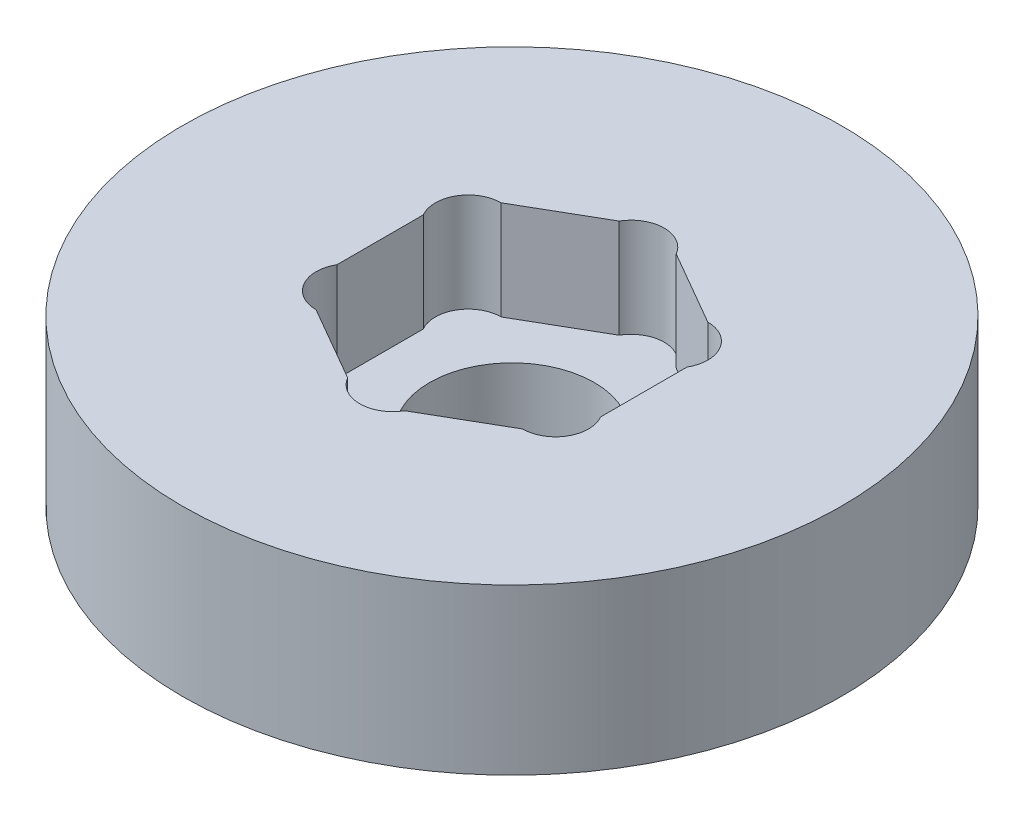
ISO-10303-21;
HEADER;
FILE_DESCRIPTION(('STEP AP214'),'2;1');
FILE_NAME('part.step','',(''),(''),'','','');
FILE_SCHEMA(('AUTOMOTIVE_DESIGN { 1 0 10303 214 1 1 1 1 }'));
ENDSEC;
DATA;
#1=APPLICATION_CONTEXT('core data for automotive mechanical design processes');
#2=APPLICATION_PROTOCOL_DEFINITION('international standard','automotive_design',2000,#1);
#3=PRODUCT_CONTEXT('',#1,'mechanical');
#4=PRODUCT('Part','Part','',(#3));
#5=PRODUCT_RELATED_PRODUCT_CATEGORY('part','',(#4));
#6=PRODUCT_DEFINITION_FORMATION('','',#4);
#7=PRODUCT_DEFINITION_CONTEXT('part definition',#1,'design');
#8=PRODUCT_DEFINITION('design','',#6,#7);
#9=PRODUCT_DEFINITION_SHAPE('','',#8);
#10=(LENGTH_UNIT() NAMED_UNIT(*) SI_UNIT(.MILLI.,.METRE.));
#11=(NAMED_UNIT(*) PLANE_ANGLE_UNIT() SI_UNIT($,.RADIAN.));
#12=(NAMED_UNIT(*) SI_UNIT($,.STERADIAN.) SOLID_ANGLE_UNIT());
#13=UNCERTAINTY_MEASURE_WITH_UNIT(LENGTH_MEASURE(1.E-05),#10,'distance_accuracy_value','');
#14=(GEOMETRIC_REPRESENTATION_CONTEXT(3) GLOBAL_UNCERTAINTY_ASSIGNED_CONTEXT((#13)) GLOBAL_UNIT_ASSIGNED_CONTEXT((#10,
#11,#12)) REPRESENTATION_CONTEXT('',''));
#15=CARTESIAN_POINT('',(0.,0.,0.));
#16=DIRECTION('',(0.,0.,1.));
#17=DIRECTION('',(1.,0.,0.));
#18=AXIS2_PLACEMENT_3D('',#15,#16,#17);
#19=CARTESIAN_POINT('',(0.,5.,0.));
#20=DIRECTION('',(0.,-1.,0.));
#21=DIRECTION('',(0.,0.,-1.));
#22=AXIS2_PLACEMENT_3D('',#19,#20,#21);
#23=CYLINDRICAL_SURFACE('',#22,10.);
#24=CARTESIAN_POINT('',(0.,5.,0.));
#25=DIRECTION('',(0.,1.,0.));
#26=DIRECTION('',(0.,0.,1.));
#27=AXIS2_PLACEMENT_3D('',#24,#25,#26);
#28=CIRCLE('',#27,10.);
#29=CARTESIAN_POINT('',(0.,5.,9.99999999999999));
#30=VERTEX_POINT('',#29);
#31=EDGE_CURVE('E11',#30,#30,#28,.T.);
#32=ORIENTED_EDGE('',*,*,#31,.F.);
#33=EDGE_LOOP('',(#32));
#34=FACE_BOUND('',#33,.T.);
#35=CARTESIAN_POINT('',(0.,0.,0.));
#36=DIRECTION('',(0.,1.,0.));
#37=DIRECTION('',(0.,0.,1.));
#38=AXIS2_PLACEMENT_3D('',#35,#36,#37);
#39=CIRCLE('',#38,10.);
#40=CARTESIAN_POINT('',(0.,0.,9.99999999999999));
#41=VERTEX_POINT('',#40);
#42=EDGE_CURVE('E43',#41,#41,#39,.T.);
#43=ORIENTED_EDGE('',*,*,#42,.T.);
#44=EDGE_LOOP('',(#43));
#45=FACE_BOUND('',#44,.T.);
#46=ADVANCED_FACE('F35',(#34,#45),#23,.T.);
#47=CARTESIAN_POINT('',(0.,5.,0.));
#48=DIRECTION('',(0.,1.,0.));
#49=DIRECTION('',(0.,0.,1.));
#50=AXIS2_PLACEMENT_3D('',#47,#48,#49);
#51=PLANE('',#50);
#52=CARTESIAN_POINT('',(-3.13397459621546,5.,-1.80940107675832));
#53=DIRECTION('',(0.,1.,0.));
#54=DIRECTION('',(0.,0.,1.));
#55=AXIS2_PLACEMENT_3D('',#52,#53,#54);
#56=CIRCLE('',#55,1.00000000000019);
#57=CARTESIAN_POINT('',(-3.13397459621554,5.,-2.80940107675852));
#58=VERTEX_POINT('',#57);
#59=CARTESIAN_POINT('',(-4.,5.,-1.30940107675811));
#60=VERTEX_POINT('',#59);
#61=EDGE_CURVE('E135',#58,#60,#56,.T.);
#62=ORIENTED_EDGE('',*,*,#61,.F.);
#63=DIRECTION('',(-0.866025403784439,0.,0.5));
#64=VECTOR('',#63,1.);
#65=CARTESIAN_POINT('',(0.,5.,-4.61880215351701));
#66=LINE('',#65,#64);
#67=CARTESIAN_POINT('',(-0.866025403784439,5.,-4.11880215351701));
#68=VERTEX_POINT('',#67);
#69=EDGE_CURVE('E142',#68,#58,#66,.T.);
#70=ORIENTED_EDGE('',*,*,#69,.F.);
#71=CARTESIAN_POINT('',(0.,5.,-3.61880215351701));
#72=DIRECTION('',(0.,1.,0.));
#73=DIRECTION('',(0.,0.,1.));
#74=AXIS2_PLACEMENT_3D('',#71,#72,#73);
#75=CIRCLE('',#74,1.);
#76=CARTESIAN_POINT('',(0.866025403784439,5.,-4.11880215351701));
#77=VERTEX_POINT('',#76);
#78=EDGE_CURVE('E58',#77,#68,#75,.T.);
#79=ORIENTED_EDGE('',*,*,#78,.F.);
#80=DIRECTION('',(-0.866025403784439,0.,-0.5));
#81=VECTOR('',#80,1.);
#82=CARTESIAN_POINT('',(4.,5.,-2.3094010767585));
#83=LINE('',#82,#81);
#84=CARTESIAN_POINT('',(3.13397459621516,5.,-2.80940107675874));
#85=VERTEX_POINT('',#84);
#86=EDGE_CURVE('E159',#85,#77,#83,.T.);
#87=ORIENTED_EDGE('',*,*,#86,.F.);
#88=CARTESIAN_POINT('',(3.13397459621566,5.,-1.80940107675868));
#89=DIRECTION('',(0.,1.,0.));
#90=DIRECTION('',(0.,0.,1.));
#91=AXIS2_PLACEMENT_3D('',#88,#89,#90);
#92=CIRCLE('',#91,1.00000000000006);
#93=CARTESIAN_POINT('',(4.,5.,-1.30940107675839));
#94=VERTEX_POINT('',#93);
#95=EDGE_CURVE('E378',#94,#85,#92,.T.);
#96=ORIENTED_EDGE('',*,*,#95,.F.);
#97=DIRECTION('',(0.,0.,-1.));
#98=VECTOR('',#97,1.);
#99=CARTESIAN_POINT('',(4.,5.,2.30940107675851));
#100=LINE('',#99,#98);
#101=CARTESIAN_POINT('',(4.,5.,1.30940107675727));
#102=VERTEX_POINT('',#101);
#103=EDGE_CURVE('E150',#102,#94,#100,.T.);
#104=ORIENTED_EDGE('',*,*,#103,.F.);
#105=CARTESIAN_POINT('',(3.13397459621587,5.,1.80940107675833));
#106=DIRECTION('',(0.,1.,0.));
#107=DIRECTION('',(0.,0.,1.));
#108=AXIS2_PLACEMENT_3D('',#105,#106,#107);
#109=CIRCLE('',#108,1.00000000000026);
#110=CARTESIAN_POINT('',(3.13397459621542,5.,2.80940107675858));
#111=VERTEX_POINT('',#110);
#112=EDGE_CURVE('E367',#111,#102,#109,.T.);
#113=ORIENTED_EDGE('',*,*,#112,.F.);
#114=DIRECTION('',(0.866025403784439,0.,-0.5));
#115=VECTOR('',#114,1.);
#116=CARTESIAN_POINT('',(0.,5.,4.61880215351701));
#117=LINE('',#116,#115);
#118=CARTESIAN_POINT('',(0.866025403785777,5.,4.11880215351623));
#119=VERTEX_POINT('',#118);
#120=EDGE_CURVE('E167',#119,#111,#117,.T.);
#121=ORIENTED_EDGE('',*,*,#120,.F.);
#122=CARTESIAN_POINT('',(4.10523822278712E-13,5.,3.61880215351701));
#123=DIRECTION('',(0.,1.,0.));
#124=DIRECTION('',(0.,0.,1.));
#125=AXIS2_PLACEMENT_3D('',#122,#123,#124);
#126=CIRCLE('',#125,1.00000000000042);
#127=CARTESIAN_POINT('',(-0.866025403784546,5.,4.11880215351695));
#128=VERTEX_POINT('',#127);
#129=EDGE_CURVE('E356',#128,#119,#126,.T.);
#130=ORIENTED_EDGE('',*,*,#129,.F.);
#131=DIRECTION('',(0.866025403784439,0.,0.5));
#132=VECTOR('',#131,1.);
#133=CARTESIAN_POINT('',(-4.,5.,2.3094010767585));
#134=LINE('',#133,#132);
#135=CARTESIAN_POINT('',(-3.13397459621459,5.,2.80940107675906));
#136=VERTEX_POINT('',#135);
#137=EDGE_CURVE('E165',#136,#128,#134,.T.);
#138=ORIENTED_EDGE('',*,*,#137,.F.);
#139=CARTESIAN_POINT('',(-3.13397459621525,5.,1.80940107675868));
#140=DIRECTION('',(0.,1.,0.));
#141=DIRECTION('',(0.,0.,1.));
#142=AXIS2_PLACEMENT_3D('',#139,#140,#141);
#143=CIRCLE('',#142,1.00000000000038);
#144=CARTESIAN_POINT('',(-4.,5.,1.30940107675846));
#145=VERTEX_POINT('',#144);
#146=EDGE_CURVE('E345',#145,#136,#143,.T.);
#147=ORIENTED_EDGE('',*,*,#146,.F.);
#148=DIRECTION('',(0.,0.,1.));
#149=VECTOR('',#148,1.);
#150=CARTESIAN_POINT('',(-4.,5.,-2.3094010767585));
#151=LINE('',#150,#149);
#152=EDGE_CURVE('E163',#60,#145,#151,.T.);
#153=ORIENTED_EDGE('',*,*,#152,.F.);
#154=EDGE_LOOP('',(#62,#70,#79,#87,#96,#104,#113,#121,#130,#138,#147,#153));
#155=FACE_BOUND('',#154,.T.);
#156=ORIENTED_EDGE('',*,*,#31,.T.);
#157=EDGE_LOOP('',(#156));
#158=FACE_BOUND('',#157,.T.);
#159=ADVANCED_FACE('F176',(#155,#158),#51,.T.);
#160=CARTESIAN_POINT('',(0.,0.,0.));
#161=DIRECTION('',(0.,1.,0.));
#162=DIRECTION('',(0.,0.,1.));
#163=AXIS2_PLACEMENT_3D('',#160,#161,#162);
#164=PLANE('',#163);
#165=CARTESIAN_POINT('',(0.,0.,0.));
#166=DIRECTION('',(0.,-1.,0.));
#167=DIRECTION('',(0.,0.,-1.));
#168=AXIS2_PLACEMENT_3D('',#165,#166,#167);
#169=CIRCLE('',#168,2.5);
#170=CARTESIAN_POINT('',(0.,0.,-2.5));
#171=VERTEX_POINT('',#170);
#172=EDGE_CURVE('E340',#171,#171,#169,.T.);
#173=ORIENTED_EDGE('',*,*,#172,.F.);
#174=EDGE_LOOP('',(#173));
#175=FACE_BOUND('',#174,.T.);
#176=ORIENTED_EDGE('',*,*,#42,.F.);
#177=EDGE_LOOP('',(#176));
#178=FACE_BOUND('',#177,.T.);
#179=ADVANCED_FACE('F173',(#175,#178),#164,.F.);
#180=CARTESIAN_POINT('',(4.,2.,-2.3094010767585));
#181=DIRECTION('',(0.5,0.,-0.866025403784439));
#182=DIRECTION('',(-0.866025403784439,0.,-0.5));
#183=AXIS2_PLACEMENT_3D('',#180,#181,#182);
#184=PLANE('',#183);
#185=DIRECTION('',(-0.866025403784439,0.,-0.5));
#186=VECTOR('',#185,1.);
#187=CARTESIAN_POINT('',(4.,2.,-2.3094010767585));
#188=LINE('',#187,#186);
#189=CARTESIAN_POINT('',(3.13397459621516,2.,-2.80940107675874));
#190=VERTEX_POINT('',#189);
#191=CARTESIAN_POINT('',(0.866025403784439,2.,-4.11880215351701));
#192=VERTEX_POINT('',#191);
#193=EDGE_CURVE('E146',#190,#192,#188,.T.);
#194=ORIENTED_EDGE('',*,*,#193,.F.);
#195=DIRECTION('',(0.,1.,0.));
#196=VECTOR('',#195,1.);
#197=CARTESIAN_POINT('',(3.13397459621516,2.,-2.80940107675874));
#198=LINE('',#197,#196);
#199=EDGE_CURVE('E386',#190,#85,#198,.T.);
#200=ORIENTED_EDGE('',*,*,#199,.T.);
#201=ORIENTED_EDGE('',*,*,#86,.T.);
#202=DIRECTION('',(0.,1.,0.));
#203=VECTOR('',#202,1.);
#204=CARTESIAN_POINT('',(0.866025403784439,2.,-4.11880215351701));
#205=LINE('',#204,#203);
#206=EDGE_CURVE('E161',#77,#192,#205,.F.);
#207=ORIENTED_EDGE('',*,*,#206,.T.);
#208=EDGE_LOOP('',(#194,#200,#201,#207));
#209=FACE_BOUND('',#208,.T.);
#210=ADVANCED_FACE('F175',(#209),#184,.F.);
#211=CARTESIAN_POINT('',(4.,2.,2.30940107675851));
#212=DIRECTION('',(1.,0.,0.));
#213=DIRECTION('',(0.,0.,-1.));
#214=AXIS2_PLACEMENT_3D('',#211,#212,#213);
#215=PLANE('',#214);
#216=DIRECTION('',(0.,0.,-1.));
#217=VECTOR('',#216,1.);
#218=CARTESIAN_POINT('',(4.,2.,2.30940107675851));
#219=LINE('',#218,#217);
#220=CARTESIAN_POINT('',(4.,2.,1.30940107675727));
#221=VERTEX_POINT('',#220);
#222=CARTESIAN_POINT('',(4.,2.,-1.30940107675839));
#223=VERTEX_POINT('',#222);
#224=EDGE_CURVE('E157',#221,#223,#219,.T.);
#225=ORIENTED_EDGE('',*,*,#224,.F.);
#226=DIRECTION('',(0.,1.,0.));
#227=VECTOR('',#226,1.);
#228=CARTESIAN_POINT('',(4.,2.,1.30940107675727));
#229=LINE('',#228,#227);
#230=EDGE_CURVE('E375',#221,#102,#229,.T.);
#231=ORIENTED_EDGE('',*,*,#230,.T.);
#232=ORIENTED_EDGE('',*,*,#103,.T.);
#233=DIRECTION('',(0.,1.,0.));
#234=VECTOR('',#233,1.);
#235=CARTESIAN_POINT('',(4.,2.,-1.30940107675839));
#236=LINE('',#235,#234);
#237=EDGE_CURVE('E382',#94,#223,#236,.F.);
#238=ORIENTED_EDGE('',*,*,#237,.T.);
#239=EDGE_LOOP('',(#225,#231,#232,#238));
#240=FACE_BOUND('',#239,.T.);
#241=ADVANCED_FACE('F182',(#240),#215,.F.);
#242=CARTESIAN_POINT('',(0.,2.,4.61880215351701));
#243=DIRECTION('',(0.5,0.,0.866025403784439));
#244=DIRECTION('',(0.866025403784439,0.,-0.5));
#245=AXIS2_PLACEMENT_3D('',#242,#243,#244);
#246=PLANE('',#245);
#247=DIRECTION('',(0.866025403784439,0.,-0.5));
#248=VECTOR('',#247,1.);
#249=CARTESIAN_POINT('',(0.,2.,4.61880215351701));
#250=LINE('',#249,#248);
#251=CARTESIAN_POINT('',(0.866025403785777,2.,4.11880215351623));
#252=VERTEX_POINT('',#251);
#253=CARTESIAN_POINT('',(3.13397459621542,2.,2.80940107675859));
#254=VERTEX_POINT('',#253);
#255=EDGE_CURVE('E155',#252,#254,#250,.T.);
#256=ORIENTED_EDGE('',*,*,#255,.F.);
#257=DIRECTION('',(0.,1.,0.));
#258=VECTOR('',#257,1.);
#259=CARTESIAN_POINT('',(0.866025403785778,2.,4.11880215351623));
#260=LINE('',#259,#258);
#261=EDGE_CURVE('E364',#252,#119,#260,.T.);
#262=ORIENTED_EDGE('',*,*,#261,.T.);
#263=ORIENTED_EDGE('',*,*,#120,.T.);
#264=DIRECTION('',(0.,1.,0.));
#265=VECTOR('',#264,1.);
#266=CARTESIAN_POINT('',(3.13397459621542,2.,2.80940107675858));
#267=LINE('',#266,#265);
#268=EDGE_CURVE('E371',#111,#254,#267,.F.);
#269=ORIENTED_EDGE('',*,*,#268,.T.);
#270=EDGE_LOOP('',(#256,#262,#263,#269));
#271=FACE_BOUND('',#270,.T.);
#272=ADVANCED_FACE('F214',(#271),#246,.F.);
#273=CARTESIAN_POINT('',(-4.,2.,2.3094010767585));
#274=DIRECTION('',(-0.5,0.,0.866025403784439));
#275=DIRECTION('',(0.866025403784439,0.,0.5));
#276=AXIS2_PLACEMENT_3D('',#273,#274,#275);
#277=PLANE('',#276);
#278=DIRECTION('',(0.866025403784439,0.,0.5));
#279=VECTOR('',#278,1.);
#280=CARTESIAN_POINT('',(-4.,2.,2.3094010767585));
#281=LINE('',#280,#279);
#282=CARTESIAN_POINT('',(-3.13397459621459,2.,2.80940107675906));
#283=VERTEX_POINT('',#282);
#284=CARTESIAN_POINT('',(-0.866025403784545,2.,4.11880215351695));
#285=VERTEX_POINT('',#284);
#286=EDGE_CURVE('E148',#283,#285,#281,.T.);
#287=ORIENTED_EDGE('',*,*,#286,.F.);
#288=DIRECTION('',(0.,1.,0.));
#289=VECTOR('',#288,1.);
#290=CARTESIAN_POINT('',(-3.13397459621459,2.,2.80940107675906));
#291=LINE('',#290,#289);
#292=EDGE_CURVE('E353',#283,#136,#291,.T.);
#293=ORIENTED_EDGE('',*,*,#292,.T.);
#294=ORIENTED_EDGE('',*,*,#137,.T.);
#295=DIRECTION('',(0.,1.,0.));
#296=VECTOR('',#295,1.);
#297=CARTESIAN_POINT('',(-0.866025403784546,2.,4.11880215351694));
#298=LINE('',#297,#296);
#299=EDGE_CURVE('E360',#128,#285,#298,.F.);
#300=ORIENTED_EDGE('',*,*,#299,.T.);
#301=EDGE_LOOP('',(#287,#293,#294,#300));
#302=FACE_BOUND('',#301,.T.);
#303=ADVANCED_FACE('F224',(#302),#277,.F.);
#304=CARTESIAN_POINT('',(-4.,2.,-2.3094010767585));
#305=DIRECTION('',(-1.,0.,0.));
#306=DIRECTION('',(0.,0.,1.));
#307=AXIS2_PLACEMENT_3D('',#304,#305,#306);
#308=PLANE('',#307);
#309=DIRECTION('',(0.,0.,1.));
#310=VECTOR('',#309,1.);
#311=CARTESIAN_POINT('',(-4.,2.,-2.3094010767585));
#312=LINE('',#311,#310);
#313=CARTESIAN_POINT('',(-4.,2.,-1.30940107675811));
#314=VERTEX_POINT('',#313);
#315=CARTESIAN_POINT('',(-4.,2.,1.30940107675846));
#316=VERTEX_POINT('',#315);
#317=EDGE_CURVE('E145',#314,#316,#312,.T.);
#318=ORIENTED_EDGE('',*,*,#317,.F.);
#319=DIRECTION('',(0.,1.,0.));
#320=VECTOR('',#319,1.);
#321=CARTESIAN_POINT('',(-4.,2.,-1.30940107675811));
#322=LINE('',#321,#320);
#323=EDGE_CURVE('E133',#314,#60,#322,.T.);
#324=ORIENTED_EDGE('',*,*,#323,.T.);
#325=ORIENTED_EDGE('',*,*,#152,.T.);
#326=DIRECTION('',(0.,1.,0.));
#327=VECTOR('',#326,1.);
#328=CARTESIAN_POINT('',(-4.,2.,1.30940107675846));
#329=LINE('',#328,#327);
#330=EDGE_CURVE('E349',#145,#316,#329,.F.);
#331=ORIENTED_EDGE('',*,*,#330,.T.);
#332=EDGE_LOOP('',(#318,#324,#325,#331));
#333=FACE_BOUND('',#332,.T.);
#334=ADVANCED_FACE('F234',(#333),#308,.F.);
#335=CARTESIAN_POINT('',(0.,2.,-4.61880215351701));
#336=DIRECTION('',(-0.5,0.,-0.866025403784439));
#337=DIRECTION('',(-0.866025403784439,0.,0.5));
#338=AXIS2_PLACEMENT_3D('',#335,#336,#337);
#339=PLANE('',#338);
#340=ORIENTED_EDGE('',*,*,#69,.T.);
#341=DIRECTION('',(0.,1.,0.));
#342=VECTOR('',#341,1.);
#343=CARTESIAN_POINT('',(-3.13397459621554,2.,-2.80940107675852));
#344=LINE('',#343,#342);
#345=CARTESIAN_POINT('',(-3.13397459621554,2.,-2.80940107675852));
#346=VERTEX_POINT('',#345);
#347=EDGE_CURVE('E130',#58,#346,#344,.F.);
#348=ORIENTED_EDGE('',*,*,#347,.T.);
#349=DIRECTION('',(-0.866025403784439,0.,0.5));
#350=VECTOR('',#349,1.);
#351=CARTESIAN_POINT('',(0.,2.,-4.61880215351701));
#352=LINE('',#351,#350);
#353=CARTESIAN_POINT('',(-0.866025403784439,2.,-4.11880215351701));
#354=VERTEX_POINT('',#353);
#355=EDGE_CURVE('E140',#354,#346,#352,.T.);
#356=ORIENTED_EDGE('',*,*,#355,.F.);
#357=DIRECTION('',(0.,1.,0.));
#358=VECTOR('',#357,1.);
#359=CARTESIAN_POINT('',(-0.86602540378444,2.,-4.118802153517));
#360=LINE('',#359,#358);
#361=EDGE_CURVE('E390',#354,#68,#360,.T.);
#362=ORIENTED_EDGE('',*,*,#361,.T.);
#363=EDGE_LOOP('',(#340,#348,#356,#362));
#364=FACE_BOUND('',#363,.T.);
#365=ADVANCED_FACE('F139',(#364),#339,.F.);
#366=CARTESIAN_POINT('',(0.,2.,0.));
#367=DIRECTION('',(0.,1.,0.));
#368=DIRECTION('',(0.,0.,1.));
#369=AXIS2_PLACEMENT_3D('',#366,#367,#368);
#370=PLANE('',#369);
#371=CARTESIAN_POINT('',(0.,2.,0.));
#372=DIRECTION('',(0.,1.,0.));
#373=DIRECTION('',(0.,0.,1.));
#374=AXIS2_PLACEMENT_3D('',#371,#372,#373);
#375=CIRCLE('',#374,2.5);
#376=CARTESIAN_POINT('',(0.,2.,2.5));
#377=VERTEX_POINT('',#376);
#378=EDGE_CURVE('E38',#377,#377,#375,.T.);
#379=ORIENTED_EDGE('',*,*,#378,.F.);
#380=EDGE_LOOP('',(#379));
#381=FACE_BOUND('',#380,.T.);
#382=ORIENTED_EDGE('',*,*,#355,.T.);
#383=CARTESIAN_POINT('',(-3.13397459621546,2.,-1.80940107675832));
#384=DIRECTION('',(0.,1.,0.));
#385=DIRECTION('',(0.,0.,1.));
#386=AXIS2_PLACEMENT_3D('',#383,#384,#385);
#387=CIRCLE('',#386,1.00000000000019);
#388=EDGE_CURVE('E127',#346,#314,#387,.T.);
#389=ORIENTED_EDGE('',*,*,#388,.T.);
#390=ORIENTED_EDGE('',*,*,#317,.T.);
#391=CARTESIAN_POINT('',(-3.13397459621525,2.,1.80940107675868));
#392=DIRECTION('',(0.,1.,0.));
#393=DIRECTION('',(0.,0.,1.));
#394=AXIS2_PLACEMENT_3D('',#391,#392,#393);
#395=CIRCLE('',#394,1.00000000000038);
#396=EDGE_CURVE('E346',#316,#283,#395,.T.);
#397=ORIENTED_EDGE('',*,*,#396,.T.);
#398=ORIENTED_EDGE('',*,*,#286,.T.);
#399=CARTESIAN_POINT('',(4.10523822278712E-13,2.,3.61880215351701));
#400=DIRECTION('',(0.,1.,0.));
#401=DIRECTION('',(0.,0.,1.));
#402=AXIS2_PLACEMENT_3D('',#399,#400,#401);
#403=CIRCLE('',#402,1.00000000000042);
#404=EDGE_CURVE('E357',#285,#252,#403,.T.);
#405=ORIENTED_EDGE('',*,*,#404,.T.);
#406=ORIENTED_EDGE('',*,*,#255,.T.);
#407=CARTESIAN_POINT('',(3.13397459621587,2.,1.80940107675833));
#408=DIRECTION('',(0.,1.,0.));
#409=DIRECTION('',(0.,0.,1.));
#410=AXIS2_PLACEMENT_3D('',#407,#408,#409);
#411=CIRCLE('',#410,1.00000000000026);
#412=EDGE_CURVE('E368',#254,#221,#411,.T.);
#413=ORIENTED_EDGE('',*,*,#412,.T.);
#414=ORIENTED_EDGE('',*,*,#224,.T.);
#415=CARTESIAN_POINT('',(3.13397459621566,2.,-1.80940107675868));
#416=DIRECTION('',(0.,1.,0.));
#417=DIRECTION('',(0.,0.,1.));
#418=AXIS2_PLACEMENT_3D('',#415,#416,#417);
#419=CIRCLE('',#418,1.00000000000006);
#420=EDGE_CURVE('E379',#223,#190,#419,.T.);
#421=ORIENTED_EDGE('',*,*,#420,.T.);
#422=ORIENTED_EDGE('',*,*,#193,.T.);
#423=CARTESIAN_POINT('',(0.,2.,-3.61880215351701));
#424=DIRECTION('',(0.,1.,0.));
#425=DIRECTION('',(0.,0.,1.));
#426=AXIS2_PLACEMENT_3D('',#423,#424,#425);
#427=CIRCLE('',#426,1.);
#428=EDGE_CURVE('E51',#192,#354,#427,.T.);
#429=ORIENTED_EDGE('',*,*,#428,.T.);
#430=EDGE_LOOP('',(#382,#389,#390,#397,#398,#405,#406,#413,#414,#421,#422,#429));
#431=FACE_BOUND('',#430,.T.);
#432=ADVANCED_FACE('F144',(#381,#431),#370,.T.);
#433=CARTESIAN_POINT('',(0.,2.,-3.61880215351701));
#434=DIRECTION('',(0.,1.,0.));
#435=DIRECTION('',(0.,0.,1.));
#436=AXIS2_PLACEMENT_3D('',#433,#434,#435);
#437=CYLINDRICAL_SURFACE('',#436,1.);
#438=ORIENTED_EDGE('',*,*,#78,.T.);
#439=ORIENTED_EDGE('',*,*,#361,.F.);
#440=ORIENTED_EDGE('',*,*,#428,.F.);
#441=ORIENTED_EDGE('',*,*,#206,.F.);
#442=EDGE_LOOP('',(#438,#439,#440,#441));
#443=FACE_BOUND('',#442,.T.);
#444=ADVANCED_FACE('F259',(#443),#437,.F.);
#445=CARTESIAN_POINT('',(3.13397459621566,2.,-1.80940107675868));
#446=DIRECTION('',(0.,1.,0.));
#447=DIRECTION('',(0.,0.,1.));
#448=AXIS2_PLACEMENT_3D('',#445,#446,#447);
#449=CYLINDRICAL_SURFACE('',#448,1.00000000000006);
#450=ORIENTED_EDGE('',*,*,#420,.F.);
#451=ORIENTED_EDGE('',*,*,#237,.F.);
#452=ORIENTED_EDGE('',*,*,#95,.T.);
#453=ORIENTED_EDGE('',*,*,#199,.F.);
#454=EDGE_LOOP('',(#450,#451,#452,#453));
#455=FACE_BOUND('',#454,.T.);
#456=ADVANCED_FACE('F264',(#455),#449,.F.);
#457=CARTESIAN_POINT('',(3.13397459621587,2.,1.80940107675833));
#458=DIRECTION('',(0.,1.,0.));
#459=DIRECTION('',(0.,0.,1.));
#460=AXIS2_PLACEMENT_3D('',#457,#458,#459);
#461=CYLINDRICAL_SURFACE('',#460,1.00000000000026);
#462=ORIENTED_EDGE('',*,*,#412,.F.);
#463=ORIENTED_EDGE('',*,*,#268,.F.);
#464=ORIENTED_EDGE('',*,*,#112,.T.);
#465=ORIENTED_EDGE('',*,*,#230,.F.);
#466=EDGE_LOOP('',(#462,#463,#464,#465));
#467=FACE_BOUND('',#466,.T.);
#468=ADVANCED_FACE('F274',(#467),#461,.F.);
#469=CARTESIAN_POINT('',(4.10523822278712E-13,2.,3.61880215351701));
#470=DIRECTION('',(0.,1.,0.));
#471=DIRECTION('',(0.,0.,1.));
#472=AXIS2_PLACEMENT_3D('',#469,#470,#471);
#473=CYLINDRICAL_SURFACE('',#472,1.00000000000042);
#474=ORIENTED_EDGE('',*,*,#404,.F.);
#475=ORIENTED_EDGE('',*,*,#299,.F.);
#476=ORIENTED_EDGE('',*,*,#129,.T.);
#477=ORIENTED_EDGE('',*,*,#261,.F.);
#478=EDGE_LOOP('',(#474,#475,#476,#477));
#479=FACE_BOUND('',#478,.T.);
#480=ADVANCED_FACE('F284',(#479),#473,.F.);
#481=CARTESIAN_POINT('',(-3.13397459621525,2.,1.80940107675868));
#482=DIRECTION('',(0.,1.,0.));
#483=DIRECTION('',(0.,0.,1.));
#484=AXIS2_PLACEMENT_3D('',#481,#482,#483);
#485=CYLINDRICAL_SURFACE('',#484,1.00000000000038);
#486=ORIENTED_EDGE('',*,*,#396,.F.);
#487=ORIENTED_EDGE('',*,*,#330,.F.);
#488=ORIENTED_EDGE('',*,*,#146,.T.);
#489=ORIENTED_EDGE('',*,*,#292,.F.);
#490=EDGE_LOOP('',(#486,#487,#488,#489));
#491=FACE_BOUND('',#490,.T.);
#492=ADVANCED_FACE('F294',(#491),#485,.F.);
#493=CARTESIAN_POINT('',(-3.13397459621546,2.,-1.80940107675832));
#494=DIRECTION('',(0.,1.,0.));
#495=DIRECTION('',(0.,0.,1.));
#496=AXIS2_PLACEMENT_3D('',#493,#494,#495);
#497=CYLINDRICAL_SURFACE('',#496,1.00000000000019);
#498=ORIENTED_EDGE('',*,*,#388,.F.);
#499=ORIENTED_EDGE('',*,*,#347,.F.);
#500=ORIENTED_EDGE('',*,*,#61,.T.);
#501=ORIENTED_EDGE('',*,*,#323,.F.);
#502=EDGE_LOOP('',(#498,#499,#500,#501));
#503=FACE_BOUND('',#502,.T.);
#504=ADVANCED_FACE('F129',(#503),#497,.F.);
#505=CARTESIAN_POINT('',(0.,3.,0.));
#506=DIRECTION('',(0.,-1.,0.));
#507=DIRECTION('',(0.,0.,-1.));
#508=AXIS2_PLACEMENT_3D('',#505,#506,#507);
#509=CYLINDRICAL_SURFACE('',#508,2.5);
#510=ORIENTED_EDGE('',*,*,#378,.T.);
#511=EDGE_LOOP('',(#510));
#512=FACE_BOUND('',#511,.T.);
#513=ORIENTED_EDGE('',*,*,#172,.T.);
#514=EDGE_LOOP('',(#513));
#515=FACE_BOUND('',#514,.T.);
#516=ADVANCED_FACE('F312',(#512,#515),#509,.F.);
#517=CLOSED_SHELL('',(#46,#159,#179,#210,#241,#272,#303,#334,#365,#432,#444,#456,#468,#480,#492,
#504,#516));
#518=MANIFOLD_SOLID_BREP('B2',#517);
#519=ADVANCED_BREP_SHAPE_REPRESENTATION('',(#18,#518),#14);
#520=SHAPE_DEFINITION_REPRESENTATION(#9,#519);
ENDSEC;
END-ISO-10303-21;
